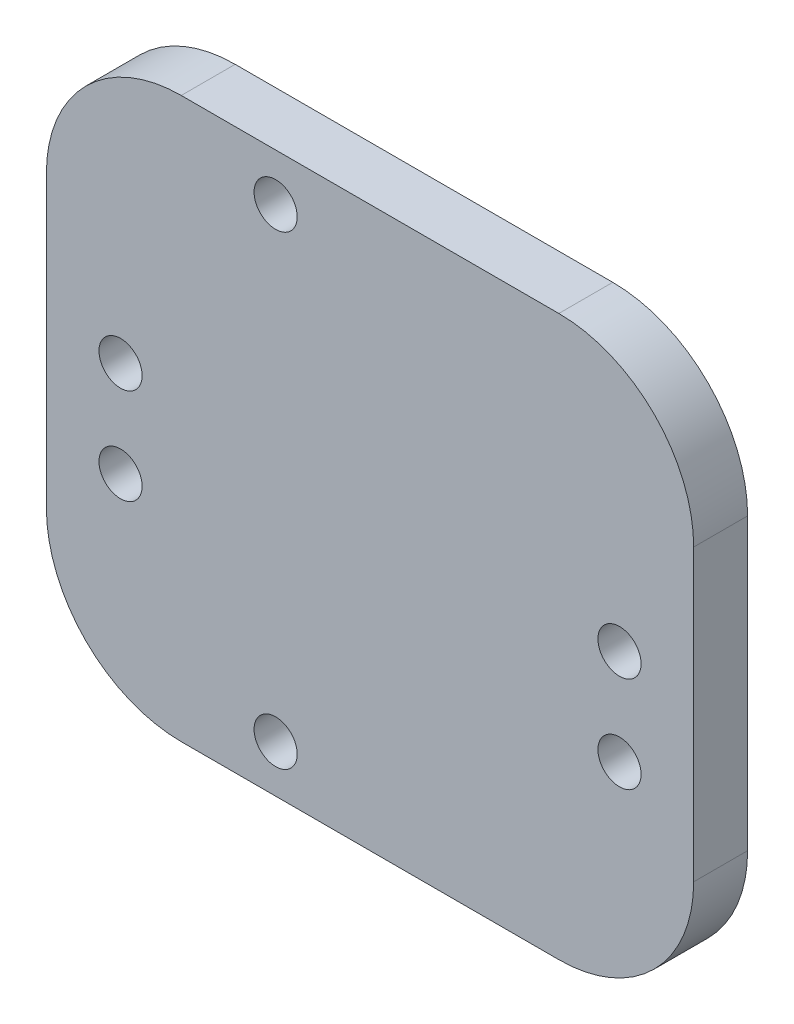
ISO-10303-21;
HEADER;
FILE_DESCRIPTION(('STEP AP214'),'2;1');
FILE_NAME('part.step','',(''),(''),'','','');
FILE_SCHEMA(('AUTOMOTIVE_DESIGN { 1 0 10303 214 1 1 1 1 }'));
ENDSEC;
DATA;
#1=APPLICATION_CONTEXT('core data for automotive mechanical design processes');
#2=APPLICATION_PROTOCOL_DEFINITION('international standard','automotive_design',2000,#1);
#3=PRODUCT_CONTEXT('',#1,'mechanical');
#4=PRODUCT('Part','Part','',(#3));
#5=PRODUCT_RELATED_PRODUCT_CATEGORY('part','',(#4));
#6=PRODUCT_DEFINITION_FORMATION('','',#4);
#7=PRODUCT_DEFINITION_CONTEXT('part definition',#1,'design');
#8=PRODUCT_DEFINITION('design','',#6,#7);
#9=PRODUCT_DEFINITION_SHAPE('','',#8);
#10=(LENGTH_UNIT() NAMED_UNIT(*) SI_UNIT(.MILLI.,.METRE.));
#11=(NAMED_UNIT(*) PLANE_ANGLE_UNIT() SI_UNIT($,.RADIAN.));
#12=(NAMED_UNIT(*) SI_UNIT($,.STERADIAN.) SOLID_ANGLE_UNIT());
#13=UNCERTAINTY_MEASURE_WITH_UNIT(LENGTH_MEASURE(1.E-05),#10,'distance_accuracy_value','');
#14=(GEOMETRIC_REPRESENTATION_CONTEXT(3) GLOBAL_UNCERTAINTY_ASSIGNED_CONTEXT((#13)) GLOBAL_UNIT_ASSIGNED_CONTEXT((#10,
#11,#12)) REPRESENTATION_CONTEXT('',''));
#15=CARTESIAN_POINT('',(0.,0.,0.));
#16=DIRECTION('',(0.,0.,1.));
#17=DIRECTION('',(1.,0.,0.));
#18=AXIS2_PLACEMENT_3D('',#15,#16,#17);
#19=CARTESIAN_POINT('',(14.,-10.75,4.));
#20=DIRECTION('',(0.,0.,1.));
#21=DIRECTION('',(1.,0.,0.));
#22=AXIS2_PLACEMENT_3D('',#19,#20,#21);
#23=PLANE('',#22);
#24=CARTESIAN_POINT('',(-18.5,1.3,4.));
#25=DIRECTION('',(0.,0.,1.));
#26=DIRECTION('',(1.,0.,0.));
#27=AXIS2_PLACEMENT_3D('',#24,#25,#26);
#28=CIRCLE('',#27,1.6);
#29=CARTESIAN_POINT('',(-16.9,1.3,4.));
#30=VERTEX_POINT('',#29);
#31=EDGE_CURVE('E246',#30,#30,#28,.T.);
#32=ORIENTED_EDGE('',*,*,#31,.F.);
#33=EDGE_LOOP('',(#32));
#34=FACE_BOUND('',#33,.T.);
#35=CARTESIAN_POINT('',(-7.,17.25,4.));
#36=DIRECTION('',(0.,0.,1.));
#37=DIRECTION('',(1.,0.,0.));
#38=AXIS2_PLACEMENT_3D('',#35,#36,#37);
#39=CIRCLE('',#38,1.6);
#40=CARTESIAN_POINT('',(-5.4,17.25,4.));
#41=VERTEX_POINT('',#40);
#42=EDGE_CURVE('E213',#41,#41,#39,.T.);
#43=ORIENTED_EDGE('',*,*,#42,.F.);
#44=EDGE_LOOP('',(#43));
#45=FACE_BOUND('',#44,.T.);
#46=CARTESIAN_POINT('',(18.5,-5.8,4.));
#47=DIRECTION('',(0.,0.,1.));
#48=DIRECTION('',(1.,0.,0.));
#49=AXIS2_PLACEMENT_3D('',#46,#47,#48);
#50=CIRCLE('',#49,1.6);
#51=CARTESIAN_POINT('',(20.1,-5.8,4.));
#52=VERTEX_POINT('',#51);
#53=EDGE_CURVE('E214',#52,#52,#50,.T.);
#54=ORIENTED_EDGE('',*,*,#53,.F.);
#55=EDGE_LOOP('',(#54));
#56=FACE_BOUND('',#55,.T.);
#57=CARTESIAN_POINT('',(18.5,1.3,4.));
#58=DIRECTION('',(0.,0.,1.));
#59=DIRECTION('',(1.,0.,0.));
#60=AXIS2_PLACEMENT_3D('',#57,#58,#59);
#61=CIRCLE('',#60,1.6);
#62=CARTESIAN_POINT('',(20.1,1.3,4.));
#63=VERTEX_POINT('',#62);
#64=EDGE_CURVE('E231',#63,#63,#61,.T.);
#65=ORIENTED_EDGE('',*,*,#64,.F.);
#66=EDGE_LOOP('',(#65));
#67=FACE_BOUND('',#66,.T.);
#68=CARTESIAN_POINT('',(-18.5,-5.8,4.));
#69=DIRECTION('',(0.,0.,1.));
#70=DIRECTION('',(1.,0.,0.));
#71=AXIS2_PLACEMENT_3D('',#68,#69,#70);
#72=CIRCLE('',#71,1.6);
#73=CARTESIAN_POINT('',(-16.9,-5.8,4.));
#74=VERTEX_POINT('',#73);
#75=EDGE_CURVE('E232',#74,#74,#72,.T.);
#76=ORIENTED_EDGE('',*,*,#75,.F.);
#77=EDGE_LOOP('',(#76));
#78=FACE_BOUND('',#77,.T.);
#79=CARTESIAN_POINT('',(14.,-10.75,4.));
#80=DIRECTION('',(0.,0.,1.));
#81=DIRECTION('',(1.,0.,0.));
#82=AXIS2_PLACEMENT_3D('',#79,#80,#81);
#83=CIRCLE('',#82,10.);
#84=CARTESIAN_POINT('',(14.,-20.75,4.));
#85=VERTEX_POINT('',#84);
#86=CARTESIAN_POINT('',(24.,-10.75,4.));
#87=VERTEX_POINT('',#86);
#88=EDGE_CURVE('E164',#85,#87,#83,.T.);
#89=ORIENTED_EDGE('',*,*,#88,.T.);
#90=DIRECTION('',(0.,1.,0.));
#91=VECTOR('',#90,1.);
#92=CARTESIAN_POINT('',(24.,10.75,4.));
#93=LINE('',#92,#91);
#94=CARTESIAN_POINT('',(24.,10.75,4.));
#95=VERTEX_POINT('',#94);
#96=EDGE_CURVE('E100',#87,#95,#93,.T.);
#97=ORIENTED_EDGE('',*,*,#96,.T.);
#98=CARTESIAN_POINT('',(14.,10.75,4.));
#99=DIRECTION('',(0.,0.,1.));
#100=DIRECTION('',(-1.,0.,0.));
#101=AXIS2_PLACEMENT_3D('',#98,#99,#100);
#102=CIRCLE('',#101,10.);
#103=CARTESIAN_POINT('',(14.,20.75,4.));
#104=VERTEX_POINT('',#103);
#105=EDGE_CURVE('E185',#95,#104,#102,.T.);
#106=ORIENTED_EDGE('',*,*,#105,.T.);
#107=DIRECTION('',(-1.,0.,0.));
#108=VECTOR('',#107,1.);
#109=CARTESIAN_POINT('',(-14.,20.75,4.));
#110=LINE('',#109,#108);
#111=CARTESIAN_POINT('',(-14.,20.75,4.));
#112=VERTEX_POINT('',#111);
#113=EDGE_CURVE('E199',#104,#112,#110,.T.);
#114=ORIENTED_EDGE('',*,*,#113,.T.);
#115=CARTESIAN_POINT('',(-14.,10.75,4.));
#116=DIRECTION('',(0.,0.,1.));
#117=DIRECTION('',(1.,0.,0.));
#118=AXIS2_PLACEMENT_3D('',#115,#116,#117);
#119=CIRCLE('',#118,10.);
#120=CARTESIAN_POINT('',(-24.,10.75,4.));
#121=VERTEX_POINT('',#120);
#122=EDGE_CURVE('E119',#112,#121,#119,.T.);
#123=ORIENTED_EDGE('',*,*,#122,.T.);
#124=DIRECTION('',(0.,-1.,0.));
#125=VECTOR('',#124,1.);
#126=CARTESIAN_POINT('',(-24.,10.75,4.));
#127=LINE('',#126,#125);
#128=CARTESIAN_POINT('',(-24.,-10.75,4.));
#129=VERTEX_POINT('',#128);
#130=EDGE_CURVE('E113',#121,#129,#127,.T.);
#131=ORIENTED_EDGE('',*,*,#130,.T.);
#132=CARTESIAN_POINT('',(-14.,-10.75,4.));
#133=DIRECTION('',(0.,0.,1.));
#134=DIRECTION('',(1.,0.,0.));
#135=AXIS2_PLACEMENT_3D('',#132,#133,#134);
#136=CIRCLE('',#135,10.);
#137=CARTESIAN_POINT('',(-14.,-20.75,4.));
#138=VERTEX_POINT('',#137);
#139=EDGE_CURVE('E117',#129,#138,#136,.T.);
#140=ORIENTED_EDGE('',*,*,#139,.T.);
#141=DIRECTION('',(1.,0.,0.));
#142=VECTOR('',#141,1.);
#143=CARTESIAN_POINT('',(-14.,-20.75,4.));
#144=LINE('',#143,#142);
#145=EDGE_CURVE('E57',#138,#85,#144,.T.);
#146=ORIENTED_EDGE('',*,*,#145,.T.);
#147=EDGE_LOOP('',(#89,#97,#106,#114,#123,#131,#140,#146));
#148=FACE_BOUND('',#147,.T.);
#149=CARTESIAN_POINT('',(-7.,-17.25,4.));
#150=DIRECTION('',(0.,0.,1.));
#151=DIRECTION('',(1.,0.,0.));
#152=AXIS2_PLACEMENT_3D('',#149,#150,#151);
#153=CIRCLE('',#152,1.6);
#154=CARTESIAN_POINT('',(-5.4,-17.25,4.));
#155=VERTEX_POINT('',#154);
#156=EDGE_CURVE('E223',#155,#155,#153,.F.);
#157=ORIENTED_EDGE('',*,*,#156,.T.);
#158=EDGE_LOOP('',(#157));
#159=FACE_BOUND('',#158,.T.);
#160=ADVANCED_FACE('F39',(#34,#45,#56,#67,#78,#148,#159),#23,.T.);
#161=CARTESIAN_POINT('',(14.,-10.75,0.));
#162=DIRECTION('',(0.,0.,1.));
#163=DIRECTION('',(1.,0.,0.));
#164=AXIS2_PLACEMENT_3D('',#161,#162,#163);
#165=PLANE('',#164);
#166=CARTESIAN_POINT('',(14.,-10.75,0.));
#167=DIRECTION('',(0.,0.,1.));
#168=DIRECTION('',(1.,0.,0.));
#169=AXIS2_PLACEMENT_3D('',#166,#167,#168);
#170=CIRCLE('',#169,10.);
#171=CARTESIAN_POINT('',(14.,-20.75,0.));
#172=VERTEX_POINT('',#171);
#173=CARTESIAN_POINT('',(24.,-10.75,0.));
#174=VERTEX_POINT('',#173);
#175=EDGE_CURVE('E141',#172,#174,#170,.T.);
#176=ORIENTED_EDGE('',*,*,#175,.F.);
#177=DIRECTION('',(1.,0.,0.));
#178=VECTOR('',#177,1.);
#179=CARTESIAN_POINT('',(-14.,-20.75,0.));
#180=LINE('',#179,#178);
#181=CARTESIAN_POINT('',(-14.,-20.75,0.));
#182=VERTEX_POINT('',#181);
#183=EDGE_CURVE('E92',#182,#172,#180,.T.);
#184=ORIENTED_EDGE('',*,*,#183,.F.);
#185=CARTESIAN_POINT('',(-14.,-10.75,0.));
#186=DIRECTION('',(0.,0.,1.));
#187=DIRECTION('',(1.,0.,0.));
#188=AXIS2_PLACEMENT_3D('',#185,#186,#187);
#189=CIRCLE('',#188,10.);
#190=CARTESIAN_POINT('',(-24.,-10.75,0.));
#191=VERTEX_POINT('',#190);
#192=EDGE_CURVE('E86',#191,#182,#189,.T.);
#193=ORIENTED_EDGE('',*,*,#192,.F.);
#194=DIRECTION('',(0.,-1.,0.));
#195=VECTOR('',#194,1.);
#196=CARTESIAN_POINT('',(-24.,10.75,0.));
#197=LINE('',#196,#195);
#198=CARTESIAN_POINT('',(-24.,10.75,0.));
#199=VERTEX_POINT('',#198);
#200=EDGE_CURVE('E128',#199,#191,#197,.T.);
#201=ORIENTED_EDGE('',*,*,#200,.F.);
#202=CARTESIAN_POINT('',(-14.,10.75,0.));
#203=DIRECTION('',(0.,0.,1.));
#204=DIRECTION('',(1.,0.,0.));
#205=AXIS2_PLACEMENT_3D('',#202,#203,#204);
#206=CIRCLE('',#205,10.);
#207=CARTESIAN_POINT('',(-14.,20.75,0.));
#208=VERTEX_POINT('',#207);
#209=EDGE_CURVE('E155',#208,#199,#206,.T.);
#210=ORIENTED_EDGE('',*,*,#209,.F.);
#211=DIRECTION('',(-1.,0.,0.));
#212=VECTOR('',#211,1.);
#213=CARTESIAN_POINT('',(-14.,20.75,0.));
#214=LINE('',#213,#212);
#215=CARTESIAN_POINT('',(14.,20.75,0.));
#216=VERTEX_POINT('',#215);
#217=EDGE_CURVE('E152',#216,#208,#214,.T.);
#218=ORIENTED_EDGE('',*,*,#217,.F.);
#219=CARTESIAN_POINT('',(14.,10.75,0.));
#220=DIRECTION('',(0.,0.,1.));
#221=DIRECTION('',(-1.,0.,0.));
#222=AXIS2_PLACEMENT_3D('',#219,#220,#221);
#223=CIRCLE('',#222,10.);
#224=CARTESIAN_POINT('',(24.,10.75,0.));
#225=VERTEX_POINT('',#224);
#226=EDGE_CURVE('E149',#225,#216,#223,.T.);
#227=ORIENTED_EDGE('',*,*,#226,.F.);
#228=DIRECTION('',(0.,1.,0.));
#229=VECTOR('',#228,1.);
#230=CARTESIAN_POINT('',(24.,10.75,0.));
#231=LINE('',#230,#229);
#232=EDGE_CURVE('E145',#174,#225,#231,.T.);
#233=ORIENTED_EDGE('',*,*,#232,.F.);
#234=EDGE_LOOP('',(#176,#184,#193,#201,#210,#218,#227,#233));
#235=FACE_BOUND('',#234,.T.);
#236=CARTESIAN_POINT('',(-18.5,-5.8,0.));
#237=DIRECTION('',(0.,0.,1.));
#238=DIRECTION('',(1.,0.,0.));
#239=AXIS2_PLACEMENT_3D('',#236,#237,#238);
#240=CIRCLE('',#239,1.6);
#241=CARTESIAN_POINT('',(-16.9,-5.8,0.));
#242=VERTEX_POINT('',#241);
#243=EDGE_CURVE('E227',#242,#242,#240,.T.);
#244=ORIENTED_EDGE('',*,*,#243,.T.);
#245=EDGE_LOOP('',(#244));
#246=FACE_BOUND('',#245,.T.);
#247=CARTESIAN_POINT('',(18.5,1.3,0.));
#248=DIRECTION('',(0.,0.,1.));
#249=DIRECTION('',(1.,0.,0.));
#250=AXIS2_PLACEMENT_3D('',#247,#248,#249);
#251=CIRCLE('',#250,1.6);
#252=CARTESIAN_POINT('',(20.1,1.3,0.));
#253=VERTEX_POINT('',#252);
#254=EDGE_CURVE('E218',#253,#253,#251,.T.);
#255=ORIENTED_EDGE('',*,*,#254,.T.);
#256=EDGE_LOOP('',(#255));
#257=FACE_BOUND('',#256,.T.);
#258=CARTESIAN_POINT('',(18.5,-5.8,0.));
#259=DIRECTION('',(0.,0.,1.));
#260=DIRECTION('',(1.,0.,0.));
#261=AXIS2_PLACEMENT_3D('',#258,#259,#260);
#262=CIRCLE('',#261,1.6);
#263=CARTESIAN_POINT('',(20.1,-5.8,0.));
#264=VERTEX_POINT('',#263);
#265=EDGE_CURVE('E209',#264,#264,#262,.T.);
#266=ORIENTED_EDGE('',*,*,#265,.T.);
#267=EDGE_LOOP('',(#266));
#268=FACE_BOUND('',#267,.T.);
#269=CARTESIAN_POINT('',(-7.,17.25,0.));
#270=DIRECTION('',(0.,0.,1.));
#271=DIRECTION('',(1.,0.,0.));
#272=AXIS2_PLACEMENT_3D('',#269,#270,#271);
#273=CIRCLE('',#272,1.6);
#274=CARTESIAN_POINT('',(-5.4,17.25,0.));
#275=VERTEX_POINT('',#274);
#276=EDGE_CURVE('E219',#275,#275,#273,.T.);
#277=ORIENTED_EDGE('',*,*,#276,.T.);
#278=EDGE_LOOP('',(#277));
#279=FACE_BOUND('',#278,.T.);
#280=CARTESIAN_POINT('',(-18.5,1.3,0.));
#281=DIRECTION('',(0.,0.,1.));
#282=DIRECTION('',(1.,0.,0.));
#283=AXIS2_PLACEMENT_3D('',#280,#281,#282);
#284=CIRCLE('',#283,1.6);
#285=CARTESIAN_POINT('',(-16.9,1.3,0.));
#286=VERTEX_POINT('',#285);
#287=EDGE_CURVE('E236',#286,#286,#284,.T.);
#288=ORIENTED_EDGE('',*,*,#287,.T.);
#289=EDGE_LOOP('',(#288));
#290=FACE_BOUND('',#289,.T.);
#291=CARTESIAN_POINT('',(-7.,-17.25,0.));
#292=DIRECTION('',(0.,0.,1.));
#293=DIRECTION('',(1.,0.,0.));
#294=AXIS2_PLACEMENT_3D('',#291,#292,#293);
#295=CIRCLE('',#294,1.6);
#296=CARTESIAN_POINT('',(-5.4,-17.25,0.));
#297=VERTEX_POINT('',#296);
#298=EDGE_CURVE('E146',#297,#297,#295,.F.);
#299=ORIENTED_EDGE('',*,*,#298,.F.);
#300=EDGE_LOOP('',(#299));
#301=FACE_BOUND('',#300,.T.);
#302=ADVANCED_FACE('F189',(#235,#246,#257,#268,#279,#290,#301),#165,.F.);
#303=CARTESIAN_POINT('',(14.,-10.75,4.));
#304=DIRECTION('',(0.,0.,-1.));
#305=DIRECTION('',(-1.,0.,0.));
#306=AXIS2_PLACEMENT_3D('',#303,#304,#305);
#307=CYLINDRICAL_SURFACE('',#306,10.);
#308=ORIENTED_EDGE('',*,*,#175,.T.);
#309=DIRECTION('',(0.,0.,-1.));
#310=VECTOR('',#309,1.);
#311=CARTESIAN_POINT('',(24.,-10.75,4.));
#312=LINE('',#311,#310);
#313=EDGE_CURVE('E11',#87,#174,#312,.T.);
#314=ORIENTED_EDGE('',*,*,#313,.F.);
#315=ORIENTED_EDGE('',*,*,#88,.F.);
#316=DIRECTION('',(0.,0.,-1.));
#317=VECTOR('',#316,1.);
#318=CARTESIAN_POINT('',(14.,-20.75,4.));
#319=LINE('',#318,#317);
#320=EDGE_CURVE('E137',#85,#172,#319,.T.);
#321=ORIENTED_EDGE('',*,*,#320,.T.);
#322=EDGE_LOOP('',(#308,#314,#315,#321));
#323=FACE_BOUND('',#322,.T.);
#324=ADVANCED_FACE('F41',(#323),#307,.T.);
#325=CARTESIAN_POINT('',(24.,10.75,4.));
#326=DIRECTION('',(-1.,0.,0.));
#327=DIRECTION('',(0.,-1.,0.));
#328=AXIS2_PLACEMENT_3D('',#325,#326,#327);
#329=PLANE('',#328);
#330=ORIENTED_EDGE('',*,*,#232,.T.);
#331=DIRECTION('',(0.,0.,-1.));
#332=VECTOR('',#331,1.);
#333=CARTESIAN_POINT('',(24.,10.75,4.));
#334=LINE('',#333,#332);
#335=EDGE_CURVE('E49',#95,#225,#334,.T.);
#336=ORIENTED_EDGE('',*,*,#335,.F.);
#337=ORIENTED_EDGE('',*,*,#96,.F.);
#338=ORIENTED_EDGE('',*,*,#313,.T.);
#339=EDGE_LOOP('',(#330,#336,#337,#338));
#340=FACE_BOUND('',#339,.T.);
#341=ADVANCED_FACE('F265',(#340),#329,.F.);
#342=CARTESIAN_POINT('',(14.,10.75,4.));
#343=DIRECTION('',(0.,0.,-1.));
#344=DIRECTION('',(-1.,0.,0.));
#345=AXIS2_PLACEMENT_3D('',#342,#343,#344);
#346=CYLINDRICAL_SURFACE('',#345,10.);
#347=ORIENTED_EDGE('',*,*,#226,.T.);
#348=DIRECTION('',(0.,0.,-1.));
#349=VECTOR('',#348,1.);
#350=CARTESIAN_POINT('',(14.,20.75,4.));
#351=LINE('',#350,#349);
#352=EDGE_CURVE('E175',#104,#216,#351,.T.);
#353=ORIENTED_EDGE('',*,*,#352,.F.);
#354=ORIENTED_EDGE('',*,*,#105,.F.);
#355=ORIENTED_EDGE('',*,*,#335,.T.);
#356=EDGE_LOOP('',(#347,#353,#354,#355));
#357=FACE_BOUND('',#356,.T.);
#358=ADVANCED_FACE('F183',(#357),#346,.T.);
#359=CARTESIAN_POINT('',(-14.,20.75,4.));
#360=DIRECTION('',(0.,-1.,0.));
#361=DIRECTION('',(0.,0.,-1.));
#362=AXIS2_PLACEMENT_3D('',#359,#360,#361);
#363=PLANE('',#362);
#364=ORIENTED_EDGE('',*,*,#217,.T.);
#365=DIRECTION('',(0.,0.,-1.));
#366=VECTOR('',#365,1.);
#367=CARTESIAN_POINT('',(-14.,20.75,4.));
#368=LINE('',#367,#366);
#369=EDGE_CURVE('E171',#112,#208,#368,.T.);
#370=ORIENTED_EDGE('',*,*,#369,.F.);
#371=ORIENTED_EDGE('',*,*,#113,.F.);
#372=ORIENTED_EDGE('',*,*,#352,.T.);
#373=EDGE_LOOP('',(#364,#370,#371,#372));
#374=FACE_BOUND('',#373,.T.);
#375=ADVANCED_FACE('F194',(#374),#363,.F.);
#376=CARTESIAN_POINT('',(-14.,10.75,4.));
#377=DIRECTION('',(0.,0.,-1.));
#378=DIRECTION('',(-1.,0.,0.));
#379=AXIS2_PLACEMENT_3D('',#376,#377,#378);
#380=CYLINDRICAL_SURFACE('',#379,10.);
#381=ORIENTED_EDGE('',*,*,#209,.T.);
#382=DIRECTION('',(0.,0.,-1.));
#383=VECTOR('',#382,1.);
#384=CARTESIAN_POINT('',(-24.,10.75,4.));
#385=LINE('',#384,#383);
#386=EDGE_CURVE('E130',#121,#199,#385,.T.);
#387=ORIENTED_EDGE('',*,*,#386,.F.);
#388=ORIENTED_EDGE('',*,*,#122,.F.);
#389=ORIENTED_EDGE('',*,*,#369,.T.);
#390=EDGE_LOOP('',(#381,#387,#388,#389));
#391=FACE_BOUND('',#390,.T.);
#392=ADVANCED_FACE('F197',(#391),#380,.T.);
#393=CARTESIAN_POINT('',(-24.,10.75,4.));
#394=DIRECTION('',(1.,0.,0.));
#395=DIRECTION('',(0.,1.,0.));
#396=AXIS2_PLACEMENT_3D('',#393,#394,#395);
#397=PLANE('',#396);
#398=ORIENTED_EDGE('',*,*,#200,.T.);
#399=DIRECTION('',(0.,0.,-1.));
#400=VECTOR('',#399,1.);
#401=CARTESIAN_POINT('',(-24.,-10.75,4.));
#402=LINE('',#401,#400);
#403=EDGE_CURVE('E125',#129,#191,#402,.T.);
#404=ORIENTED_EDGE('',*,*,#403,.F.);
#405=ORIENTED_EDGE('',*,*,#130,.F.);
#406=ORIENTED_EDGE('',*,*,#386,.T.);
#407=EDGE_LOOP('',(#398,#404,#405,#406));
#408=FACE_BOUND('',#407,.T.);
#409=ADVANCED_FACE('F126',(#408),#397,.F.);
#410=CARTESIAN_POINT('',(-14.,-10.75,4.));
#411=DIRECTION('',(0.,0.,-1.));
#412=DIRECTION('',(-1.,0.,0.));
#413=AXIS2_PLACEMENT_3D('',#410,#411,#412);
#414=CYLINDRICAL_SURFACE('',#413,10.);
#415=ORIENTED_EDGE('',*,*,#192,.T.);
#416=DIRECTION('',(0.,0.,-1.));
#417=VECTOR('',#416,1.);
#418=CARTESIAN_POINT('',(-14.,-20.75,4.));
#419=LINE('',#418,#417);
#420=EDGE_CURVE('E131',#138,#182,#419,.T.);
#421=ORIENTED_EDGE('',*,*,#420,.F.);
#422=ORIENTED_EDGE('',*,*,#139,.F.);
#423=ORIENTED_EDGE('',*,*,#403,.T.);
#424=EDGE_LOOP('',(#415,#421,#422,#423));
#425=FACE_BOUND('',#424,.T.);
#426=ADVANCED_FACE('F133',(#425),#414,.T.);
#427=CARTESIAN_POINT('',(-14.,-20.75,4.));
#428=DIRECTION('',(0.,1.,0.));
#429=DIRECTION('',(0.,0.,1.));
#430=AXIS2_PLACEMENT_3D('',#427,#428,#429);
#431=PLANE('',#430);
#432=ORIENTED_EDGE('',*,*,#183,.T.);
#433=ORIENTED_EDGE('',*,*,#320,.F.);
#434=ORIENTED_EDGE('',*,*,#145,.F.);
#435=ORIENTED_EDGE('',*,*,#420,.T.);
#436=EDGE_LOOP('',(#432,#433,#434,#435));
#437=FACE_BOUND('',#436,.T.);
#438=ADVANCED_FACE('F271',(#437),#431,.F.);
#439=CARTESIAN_POINT('',(-18.5,-5.8,4.001));
#440=DIRECTION('',(0.,0.,-1.));
#441=DIRECTION('',(-1.,0.,0.));
#442=AXIS2_PLACEMENT_3D('',#439,#440,#441);
#443=CYLINDRICAL_SURFACE('',#442,1.6);
#444=ORIENTED_EDGE('',*,*,#75,.T.);
#445=EDGE_LOOP('',(#444));
#446=FACE_BOUND('',#445,.T.);
#447=ORIENTED_EDGE('',*,*,#243,.F.);
#448=EDGE_LOOP('',(#447));
#449=FACE_BOUND('',#448,.T.);
#450=ADVANCED_FACE('F274',(#446,#449),#443,.F.);
#451=CARTESIAN_POINT('',(18.5,1.3,4.001));
#452=DIRECTION('',(0.,0.,-1.));
#453=DIRECTION('',(-1.,0.,0.));
#454=AXIS2_PLACEMENT_3D('',#451,#452,#453);
#455=CYLINDRICAL_SURFACE('',#454,1.6);
#456=ORIENTED_EDGE('',*,*,#64,.T.);
#457=EDGE_LOOP('',(#456));
#458=FACE_BOUND('',#457,.T.);
#459=ORIENTED_EDGE('',*,*,#254,.F.);
#460=EDGE_LOOP('',(#459));
#461=FACE_BOUND('',#460,.T.);
#462=ADVANCED_FACE('F322',(#458,#461),#455,.F.);
#463=CARTESIAN_POINT('',(18.5,-5.8,4.001));
#464=DIRECTION('',(0.,0.,-1.));
#465=DIRECTION('',(-1.,0.,0.));
#466=AXIS2_PLACEMENT_3D('',#463,#464,#465);
#467=CYLINDRICAL_SURFACE('',#466,1.6);
#468=ORIENTED_EDGE('',*,*,#53,.T.);
#469=EDGE_LOOP('',(#468));
#470=FACE_BOUND('',#469,.T.);
#471=ORIENTED_EDGE('',*,*,#265,.F.);
#472=EDGE_LOOP('',(#471));
#473=FACE_BOUND('',#472,.T.);
#474=ADVANCED_FACE('F330',(#470,#473),#467,.F.);
#475=CARTESIAN_POINT('',(-7.,17.25,4.001));
#476=DIRECTION('',(0.,0.,-1.));
#477=DIRECTION('',(-1.,0.,0.));
#478=AXIS2_PLACEMENT_3D('',#475,#476,#477);
#479=CYLINDRICAL_SURFACE('',#478,1.6);
#480=ORIENTED_EDGE('',*,*,#42,.T.);
#481=EDGE_LOOP('',(#480));
#482=FACE_BOUND('',#481,.T.);
#483=ORIENTED_EDGE('',*,*,#276,.F.);
#484=EDGE_LOOP('',(#483));
#485=FACE_BOUND('',#484,.T.);
#486=ADVANCED_FACE('F338',(#482,#485),#479,.F.);
#487=CARTESIAN_POINT('',(-18.5,1.3,4.001));
#488=DIRECTION('',(0.,0.,-1.));
#489=DIRECTION('',(-1.,0.,0.));
#490=AXIS2_PLACEMENT_3D('',#487,#488,#489);
#491=CYLINDRICAL_SURFACE('',#490,1.6);
#492=ORIENTED_EDGE('',*,*,#31,.T.);
#493=EDGE_LOOP('',(#492));
#494=FACE_BOUND('',#493,.T.);
#495=ORIENTED_EDGE('',*,*,#287,.F.);
#496=EDGE_LOOP('',(#495));
#497=FACE_BOUND('',#496,.T.);
#498=ADVANCED_FACE('F345',(#494,#497),#491,.F.);
#499=CARTESIAN_POINT('',(-7.,-17.25,4.001));
#500=DIRECTION('',(0.,0.,-1.));
#501=DIRECTION('',(-1.,0.,0.));
#502=AXIS2_PLACEMENT_3D('',#499,#500,#501);
#503=CYLINDRICAL_SURFACE('',#502,1.6);
#504=ORIENTED_EDGE('',*,*,#156,.F.);
#505=EDGE_LOOP('',(#504));
#506=FACE_BOUND('',#505,.T.);
#507=ORIENTED_EDGE('',*,*,#298,.T.);
#508=EDGE_LOOP('',(#507));
#509=FACE_BOUND('',#508,.T.);
#510=ADVANCED_FACE('F257',(#506,#509),#503,.F.);
#511=CLOSED_SHELL('',(#160,#302,#324,#341,#358,#375,#392,#409,#426,#438,#450,#462,#474,#486,
#498,#510));
#512=MANIFOLD_SOLID_BREP('B2',#511);
#513=ADVANCED_BREP_SHAPE_REPRESENTATION('',(#18,#512),#14);
#514=SHAPE_DEFINITION_REPRESENTATION(#9,#513);
ENDSEC;
END-ISO-10303-21;
